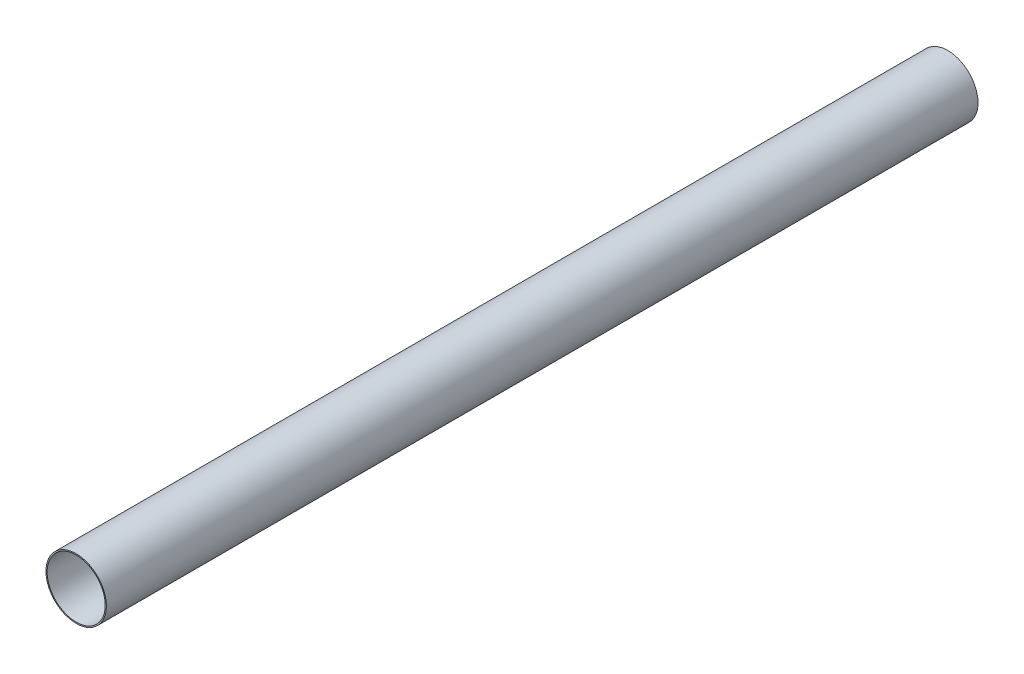
ISO-10303-21;
HEADER;
FILE_DESCRIPTION(('STEP AP214'),'2;1');
FILE_NAME('part.step','',(''),(''),'','','');
FILE_SCHEMA(('AUTOMOTIVE_DESIGN { 1 0 10303 214 1 1 1 1 }'));
ENDSEC;
DATA;
#1=APPLICATION_CONTEXT('core data for automotive mechanical design processes');
#2=APPLICATION_PROTOCOL_DEFINITION('international standard','automotive_design',2000,#1);
#3=PRODUCT_CONTEXT('',#1,'mechanical');
#4=PRODUCT('Part','Part','',(#3));
#5=PRODUCT_RELATED_PRODUCT_CATEGORY('part','',(#4));
#6=PRODUCT_DEFINITION_FORMATION('','',#4);
#7=PRODUCT_DEFINITION_CONTEXT('part definition',#1,'design');
#8=PRODUCT_DEFINITION('design','',#6,#7);
#9=PRODUCT_DEFINITION_SHAPE('','',#8);
#10=(LENGTH_UNIT() NAMED_UNIT(*) SI_UNIT(.MILLI.,.METRE.));
#11=(NAMED_UNIT(*) PLANE_ANGLE_UNIT() SI_UNIT($,.RADIAN.));
#12=(NAMED_UNIT(*) SI_UNIT($,.STERADIAN.) SOLID_ANGLE_UNIT());
#13=UNCERTAINTY_MEASURE_WITH_UNIT(LENGTH_MEASURE(1.E-05),#10,'distance_accuracy_value','');
#14=(GEOMETRIC_REPRESENTATION_CONTEXT(3) GLOBAL_UNCERTAINTY_ASSIGNED_CONTEXT((#13)) GLOBAL_UNIT_ASSIGNED_CONTEXT((#10,
#11,#12)) REPRESENTATION_CONTEXT('',''));
#15=CARTESIAN_POINT('',(0.,0.,0.));
#16=DIRECTION('',(0.,0.,1.));
#17=DIRECTION('',(1.,0.,0.));
#18=AXIS2_PLACEMENT_3D('',#15,#16,#17);
#19=CARTESIAN_POINT('',(0.,0.,1143.));
#20=DIRECTION('',(0.,0.,1.));
#21=DIRECTION('',(1.,0.,0.));
#22=AXIS2_PLACEMENT_3D('',#19,#20,#21);
#23=PLANE('',#22);
#24=CARTESIAN_POINT('',(0.,0.,1143.));
#25=DIRECTION('',(0.,0.,1.));
#26=DIRECTION('',(1.,0.,0.));
#27=AXIS2_PLACEMENT_3D('',#24,#25,#26);
#28=CIRCLE('',#27,39.624);
#29=CARTESIAN_POINT('',(39.624,0.,1143.));
#30=VERTEX_POINT('',#29);
#31=EDGE_CURVE('E10',#30,#30,#28,.T.);
#32=ORIENTED_EDGE('',*,*,#31,.T.);
#33=EDGE_LOOP('',(#32));
#34=FACE_BOUND('',#33,.T.);
#35=CARTESIAN_POINT('',(0.,0.,1143.));
#36=DIRECTION('',(0.,0.,1.));
#37=DIRECTION('',(1.,0.,0.));
#38=AXIS2_PLACEMENT_3D('',#35,#36,#37);
#39=CIRCLE('',#38,38.1);
#40=CARTESIAN_POINT('',(38.1,0.,1143.));
#41=VERTEX_POINT('',#40);
#42=EDGE_CURVE('E44',#41,#41,#39,.T.);
#43=ORIENTED_EDGE('',*,*,#42,.F.);
#44=EDGE_LOOP('',(#43));
#45=FACE_BOUND('',#44,.T.);
#46=ADVANCED_FACE('F33',(#34,#45),#23,.T.);
#47=CARTESIAN_POINT('',(0.,0.,0.));
#48=DIRECTION('',(0.,0.,1.));
#49=DIRECTION('',(1.,0.,0.));
#50=AXIS2_PLACEMENT_3D('',#47,#48,#49);
#51=PLANE('',#50);
#52=CARTESIAN_POINT('',(0.,0.,0.));
#53=DIRECTION('',(0.,0.,1.));
#54=DIRECTION('',(1.,0.,0.));
#55=AXIS2_PLACEMENT_3D('',#52,#53,#54);
#56=CIRCLE('',#55,39.624);
#57=CARTESIAN_POINT('',(39.624,0.,0.));
#58=VERTEX_POINT('',#57);
#59=EDGE_CURVE('E37',#58,#58,#56,.T.);
#60=ORIENTED_EDGE('',*,*,#59,.F.);
#61=EDGE_LOOP('',(#60));
#62=FACE_BOUND('',#61,.T.);
#63=CARTESIAN_POINT('',(0.,0.,0.));
#64=DIRECTION('',(0.,0.,1.));
#65=DIRECTION('',(1.,0.,0.));
#66=AXIS2_PLACEMENT_3D('',#63,#64,#65);
#67=CIRCLE('',#66,38.1);
#68=CARTESIAN_POINT('',(38.1,0.,0.));
#69=VERTEX_POINT('',#68);
#70=EDGE_CURVE('E46',#69,#69,#67,.T.);
#71=ORIENTED_EDGE('',*,*,#70,.T.);
#72=EDGE_LOOP('',(#71));
#73=FACE_BOUND('',#72,.T.);
#74=ADVANCED_FACE('F56',(#62,#73),#51,.F.);
#75=CARTESIAN_POINT('',(0.,0.,1143.));
#76=DIRECTION('',(0.,0.,-1.));
#77=DIRECTION('',(-1.,0.,0.));
#78=AXIS2_PLACEMENT_3D('',#75,#76,#77);
#79=CYLINDRICAL_SURFACE('',#78,39.624);
#80=ORIENTED_EDGE('',*,*,#31,.F.);
#81=EDGE_LOOP('',(#80));
#82=FACE_BOUND('',#81,.T.);
#83=ORIENTED_EDGE('',*,*,#59,.T.);
#84=EDGE_LOOP('',(#83));
#85=FACE_BOUND('',#84,.T.);
#86=ADVANCED_FACE('F35',(#82,#85),#79,.T.);
#87=CARTESIAN_POINT('',(0.,0.,1143.));
#88=DIRECTION('',(0.,0.,-1.));
#89=DIRECTION('',(-1.,0.,0.));
#90=AXIS2_PLACEMENT_3D('',#87,#88,#89);
#91=CYLINDRICAL_SURFACE('',#90,38.1);
#92=ORIENTED_EDGE('',*,*,#42,.T.);
#93=EDGE_LOOP('',(#92));
#94=FACE_BOUND('',#93,.T.);
#95=ORIENTED_EDGE('',*,*,#70,.F.);
#96=EDGE_LOOP('',(#95));
#97=FACE_BOUND('',#96,.T.);
#98=ADVANCED_FACE('F52',(#94,#97),#91,.F.);
#99=CLOSED_SHELL('',(#46,#74,#86,#98));
#100=MANIFOLD_SOLID_BREP('B2',#99);
#101=ADVANCED_BREP_SHAPE_REPRESENTATION('',(#18,#100),#14);
#102=SHAPE_DEFINITION_REPRESENTATION(#9,#101);
ENDSEC;
END-ISO-10303-21;
